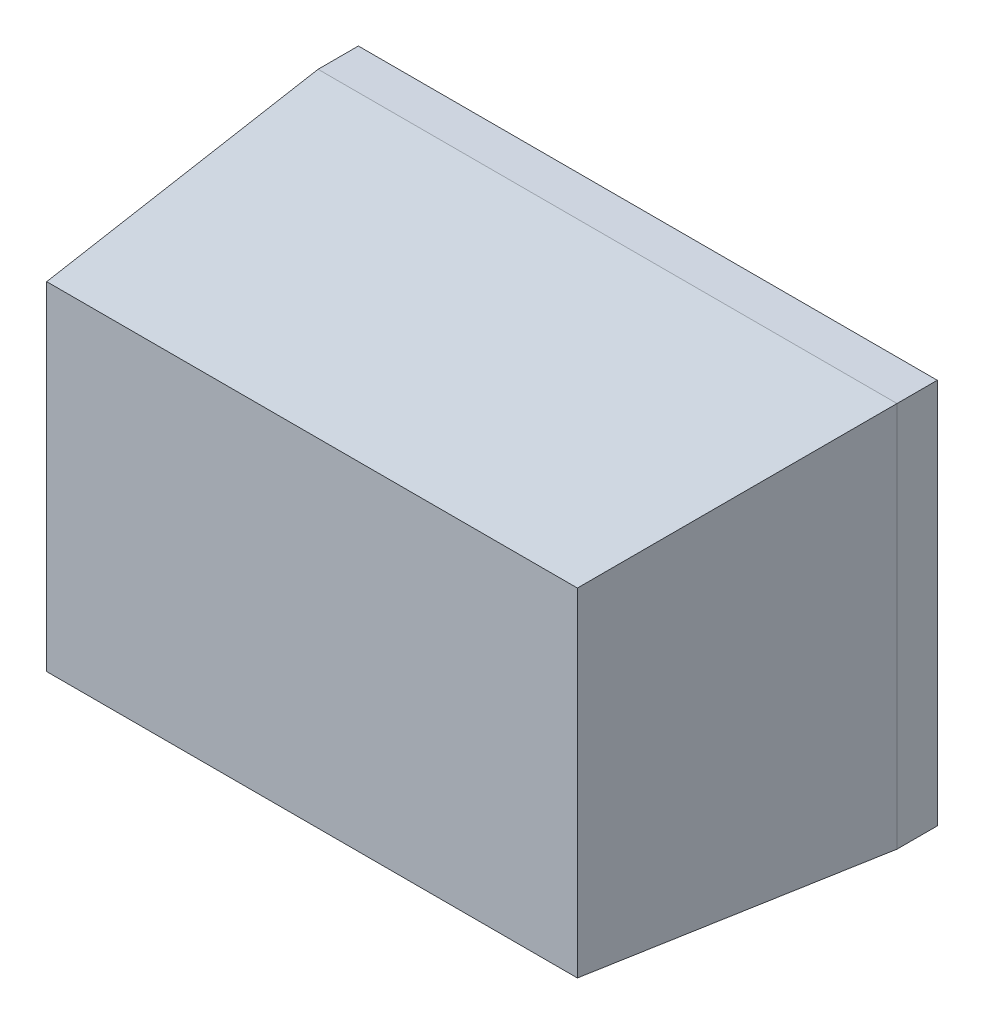
ISO-10303-21;
HEADER;
FILE_DESCRIPTION(('STEP AP214'),'2;1');
FILE_NAME('part.step','',(''),(''),'','','');
FILE_SCHEMA(('AUTOMOTIVE_DESIGN { 1 0 10303 214 1 1 1 1 }'));
ENDSEC;
DATA;
#1=APPLICATION_CONTEXT('core data for automotive mechanical design processes');
#2=APPLICATION_PROTOCOL_DEFINITION('international standard','automotive_design',2000,#1);
#3=PRODUCT_CONTEXT('',#1,'mechanical');
#4=PRODUCT('Part','Part','',(#3));
#5=PRODUCT_RELATED_PRODUCT_CATEGORY('part','',(#4));
#6=PRODUCT_DEFINITION_FORMATION('','',#4);
#7=PRODUCT_DEFINITION_CONTEXT('part definition',#1,'design');
#8=PRODUCT_DEFINITION('design','',#6,#7);
#9=PRODUCT_DEFINITION_SHAPE('','',#8);
#10=(LENGTH_UNIT() NAMED_UNIT(*) SI_UNIT(.MILLI.,.METRE.));
#11=(NAMED_UNIT(*) PLANE_ANGLE_UNIT() SI_UNIT($,.RADIAN.));
#12=(NAMED_UNIT(*) SI_UNIT($,.STERADIAN.) SOLID_ANGLE_UNIT());
#13=UNCERTAINTY_MEASURE_WITH_UNIT(LENGTH_MEASURE(1.E-05),#10,'distance_accuracy_value','');
#14=(GEOMETRIC_REPRESENTATION_CONTEXT(3) GLOBAL_UNCERTAINTY_ASSIGNED_CONTEXT((#13)) GLOBAL_UNIT_ASSIGNED_CONTEXT((#10,
#11,#12)) REPRESENTATION_CONTEXT('',''));
#15=CARTESIAN_POINT('',(0.,0.,0.));
#16=DIRECTION('',(0.,0.,1.));
#17=DIRECTION('',(1.,0.,0.));
#18=AXIS2_PLACEMENT_3D('',#15,#16,#17);
#19=CARTESIAN_POINT('',(-0.6,-0.4,0.698));
#20=DIRECTION('',(0.,0.,1.));
#21=DIRECTION('',(1.,0.,0.));
#22=AXIS2_PLACEMENT_3D('',#19,#20,#21);
#23=PLANE('',#22);
#24=DIRECTION('',(0.,1.,0.));
#25=VECTOR('',#24,1.);
#26=CARTESIAN_POINT('',(0.550000000000018,-0.4,0.698000000000001));
#27=LINE('',#26,#25);
#28=CARTESIAN_POINT('',(0.550000000000004,0.350000000000004,0.698000000000001));
#29=VERTEX_POINT('',#28);
#30=CARTESIAN_POINT('',(0.550000000000005,-0.350000000000009,0.698000000000001));
#31=VERTEX_POINT('',#30);
#32=EDGE_CURVE('E87',#29,#31,#27,.F.);
#33=ORIENTED_EDGE('',*,*,#32,.F.);
#34=DIRECTION('',(1.,0.,0.));
#35=VECTOR('',#34,1.);
#36=CARTESIAN_POINT('',(-0.6,0.350000000000018,0.698000000000002));
#37=LINE('',#36,#35);
#38=CARTESIAN_POINT('',(-0.550000000000004,0.350000000000004,0.698000000000001));
#39=VERTEX_POINT('',#38);
#40=EDGE_CURVE('E79',#39,#29,#37,.T.);
#41=ORIENTED_EDGE('',*,*,#40,.F.);
#42=DIRECTION('',(0.,1.,0.));
#43=VECTOR('',#42,1.);
#44=CARTESIAN_POINT('',(-0.550000000000018,-0.4,0.698000000000001));
#45=LINE('',#44,#43);
#46=CARTESIAN_POINT('',(-0.550000000000004,-0.350000000000004,0.698000000000001));
#47=VERTEX_POINT('',#46);
#48=EDGE_CURVE('E20',#39,#47,#45,.F.);
#49=ORIENTED_EDGE('',*,*,#48,.T.);
#50=DIRECTION('',(1.,0.,0.));
#51=VECTOR('',#50,1.);
#52=CARTESIAN_POINT('',(-0.6,-0.350000000000018,0.698000000000002));
#53=LINE('',#52,#51);
#54=EDGE_CURVE('E68',#47,#31,#53,.T.);
#55=ORIENTED_EDGE('',*,*,#54,.T.);
#56=EDGE_LOOP('',(#33,#41,#49,#55));
#57=FACE_BOUND('',#56,.T.);
#58=ADVANCED_FACE('F17',(#57),#23,.T.);
#59=CARTESIAN_POINT('',(-0.575,-0.4,0.39175));
#60=DIRECTION('',(0.996684615822613,0.,-0.0813620094548484));
#61=DIRECTION('',(-0.0813620094548484,0.,-0.996684615822613));
#62=AXIS2_PLACEMENT_3D('',#59,#60,#61);
#63=PLANE('',#62);
#64=DIRECTION('',(0.0810940399844702,-0.0810940399844122,0.993401989809766));
#65=VECTOR('',#64,1.);
#66=CARTESIAN_POINT('',(-0.6,0.399999999999982,0.0854999999999985));
#67=LINE('',#66,#65);
#68=CARTESIAN_POINT('',(-0.599999999999991,0.399999999999998,0.0854999999999991));
#69=VERTEX_POINT('',#68);
#70=EDGE_CURVE('E94',#69,#39,#67,.T.);
#71=ORIENTED_EDGE('',*,*,#70,.F.);
#72=DIRECTION('',(0.,1.,0.));
#73=VECTOR('',#72,1.);
#74=CARTESIAN_POINT('',(-0.6,-0.4,0.0855));
#75=LINE('',#74,#73);
#76=CARTESIAN_POINT('',(-0.599999999999991,-0.399999999999998,0.0854999999999991));
#77=VERTEX_POINT('',#76);
#78=EDGE_CURVE('E84',#69,#77,#75,.F.);
#79=ORIENTED_EDGE('',*,*,#78,.T.);
#80=DIRECTION('',(0.0810940399844702,0.0810940399844122,0.993401989809766));
#81=VECTOR('',#80,1.);
#82=CARTESIAN_POINT('',(-0.6,-0.399999999999982,0.0854999999999985));
#83=LINE('',#82,#81);
#84=EDGE_CURVE('E75',#77,#47,#83,.T.);
#85=ORIENTED_EDGE('',*,*,#84,.T.);
#86=ORIENTED_EDGE('',*,*,#48,.F.);
#87=EDGE_LOOP('',(#71,#79,#85,#86));
#88=FACE_BOUND('',#87,.T.);
#89=ADVANCED_FACE('F83',(#88),#63,.F.);
#90=CARTESIAN_POINT('',(-0.6,-0.375,0.39175));
#91=DIRECTION('',(0.,0.996684615822613,-0.0813620094548484));
#92=DIRECTION('',(0.,0.0813620094548484,0.996684615822613));
#93=AXIS2_PLACEMENT_3D('',#90,#91,#92);
#94=PLANE('',#93);
#95=DIRECTION('',(1.,0.,0.));
#96=VECTOR('',#95,1.);
#97=CARTESIAN_POINT('',(-0.6,-0.4,0.0855));
#98=LINE('',#97,#96);
#99=CARTESIAN_POINT('',(0.599999999999998,-0.399999999999991,0.0854999999999991));
#100=VERTEX_POINT('',#99);
#101=EDGE_CURVE('E100',#77,#100,#98,.T.);
#102=ORIENTED_EDGE('',*,*,#101,.T.);
#103=DIRECTION('',(0.0810940399844122,-0.0810940399844704,-0.993401989809767));
#104=VECTOR('',#103,1.);
#105=CARTESIAN_POINT('',(0.550000000000018,-0.35,0.698000000000001));
#106=LINE('',#105,#104);
#107=EDGE_CURVE('E77',#31,#100,#106,.T.);
#108=ORIENTED_EDGE('',*,*,#107,.F.);
#109=ORIENTED_EDGE('',*,*,#54,.F.);
#110=ORIENTED_EDGE('',*,*,#84,.F.);
#111=EDGE_LOOP('',(#102,#108,#109,#110));
#112=FACE_BOUND('',#111,.T.);
#113=ADVANCED_FACE('F73',(#112),#94,.F.);
#114=CARTESIAN_POINT('',(0.575,-0.4,0.39175));
#115=DIRECTION('',(0.996684615822613,0.,0.0813620094548484));
#116=DIRECTION('',(0.0813620094548484,0.,-0.996684615822613));
#117=AXIS2_PLACEMENT_3D('',#114,#115,#116);
#118=PLANE('',#117);
#119=DIRECTION('',(0.0810940399844702,0.0810940399844122,-0.993401989809766));
#120=VECTOR('',#119,1.);
#121=CARTESIAN_POINT('',(0.55,0.350000000000018,0.698000000000002));
#122=LINE('',#121,#120);
#123=CARTESIAN_POINT('',(0.599999999999991,0.399999999999998,0.0854999999999991));
#124=VERTEX_POINT('',#123);
#125=EDGE_CURVE('E92',#29,#124,#122,.T.);
#126=ORIENTED_EDGE('',*,*,#125,.F.);
#127=ORIENTED_EDGE('',*,*,#32,.T.);
#128=ORIENTED_EDGE('',*,*,#107,.T.);
#129=DIRECTION('',(0.,1.,0.));
#130=VECTOR('',#129,1.);
#131=CARTESIAN_POINT('',(0.6,-0.4,0.0855));
#132=LINE('',#131,#130);
#133=EDGE_CURVE('E104',#124,#100,#132,.F.);
#134=ORIENTED_EDGE('',*,*,#133,.F.);
#135=EDGE_LOOP('',(#126,#127,#128,#134));
#136=FACE_BOUND('',#135,.T.);
#137=ADVANCED_FACE('F150',(#136),#118,.T.);
#138=CARTESIAN_POINT('',(-0.6,0.375,0.39175));
#139=DIRECTION('',(0.,0.996684615822613,0.0813620094548484));
#140=DIRECTION('',(0.,-0.0813620094548484,0.996684615822613));
#141=AXIS2_PLACEMENT_3D('',#138,#139,#140);
#142=PLANE('',#141);
#143=DIRECTION('',(1.,0.,0.));
#144=VECTOR('',#143,1.);
#145=CARTESIAN_POINT('',(-0.6,0.4,0.0855));
#146=LINE('',#145,#144);
#147=EDGE_CURVE('E111',#69,#124,#146,.T.);
#148=ORIENTED_EDGE('',*,*,#147,.F.);
#149=ORIENTED_EDGE('',*,*,#70,.T.);
#150=ORIENTED_EDGE('',*,*,#40,.T.);
#151=ORIENTED_EDGE('',*,*,#125,.T.);
#152=EDGE_LOOP('',(#148,#149,#150,#151));
#153=FACE_BOUND('',#152,.T.);
#154=ADVANCED_FACE('F147',(#153),#142,.T.);
#155=CARTESIAN_POINT('',(-0.6,-0.4,0.002));
#156=DIRECTION('',(1.,0.,0.));
#157=DIRECTION('',(0.,0.,-1.));
#158=AXIS2_PLACEMENT_3D('',#155,#156,#157);
#159=PLANE('',#158);
#160=DIRECTION('',(0.,0.,1.));
#161=VECTOR('',#160,1.);
#162=CARTESIAN_POINT('',(-0.6,0.4,0.002));
#163=LINE('',#162,#161);
#164=CARTESIAN_POINT('',(-0.6,0.4,0.002));
#165=VERTEX_POINT('',#164);
#166=EDGE_CURVE('E108',#165,#69,#163,.T.);
#167=ORIENTED_EDGE('',*,*,#166,.F.);
#168=DIRECTION('',(0.,1.,0.));
#169=VECTOR('',#168,1.);
#170=CARTESIAN_POINT('',(-0.6,-0.4,0.002));
#171=LINE('',#170,#169);
#172=CARTESIAN_POINT('',(-0.6,-0.4,0.002));
#173=VERTEX_POINT('',#172);
#174=EDGE_CURVE('E113',#165,#173,#171,.F.);
#175=ORIENTED_EDGE('',*,*,#174,.T.);
#176=DIRECTION('',(0.,0.,1.));
#177=VECTOR('',#176,1.);
#178=CARTESIAN_POINT('',(-0.6,-0.4,0.002));
#179=LINE('',#178,#177);
#180=EDGE_CURVE('E97',#173,#77,#179,.T.);
#181=ORIENTED_EDGE('',*,*,#180,.T.);
#182=ORIENTED_EDGE('',*,*,#78,.F.);
#183=EDGE_LOOP('',(#167,#175,#181,#182));
#184=FACE_BOUND('',#183,.T.);
#185=ADVANCED_FACE('F131',(#184),#159,.F.);
#186=CARTESIAN_POINT('',(-0.6,-0.4,0.002));
#187=DIRECTION('',(0.,1.,0.));
#188=DIRECTION('',(0.,0.,1.));
#189=AXIS2_PLACEMENT_3D('',#186,#187,#188);
#190=PLANE('',#189);
#191=ORIENTED_EDGE('',*,*,#180,.F.);
#192=DIRECTION('',(1.,0.,0.));
#193=VECTOR('',#192,1.);
#194=CARTESIAN_POINT('',(-0.6,-0.4,0.002));
#195=LINE('',#194,#193);
#196=CARTESIAN_POINT('',(0.6,-0.4,0.002));
#197=VERTEX_POINT('',#196);
#198=EDGE_CURVE('E116',#173,#197,#195,.T.);
#199=ORIENTED_EDGE('',*,*,#198,.T.);
#200=DIRECTION('',(0.,0.,-1.));
#201=VECTOR('',#200,1.);
#202=CARTESIAN_POINT('',(0.6,-0.4,0.002));
#203=LINE('',#202,#201);
#204=EDGE_CURVE('E102',#100,#197,#203,.T.);
#205=ORIENTED_EDGE('',*,*,#204,.F.);
#206=ORIENTED_EDGE('',*,*,#101,.F.);
#207=EDGE_LOOP('',(#191,#199,#205,#206));
#208=FACE_BOUND('',#207,.T.);
#209=ADVANCED_FACE('F128',(#208),#190,.F.);
#210=CARTESIAN_POINT('',(0.6,-0.4,0.002));
#211=DIRECTION('',(1.,0.,0.));
#212=DIRECTION('',(0.,0.,-1.));
#213=AXIS2_PLACEMENT_3D('',#210,#211,#212);
#214=PLANE('',#213);
#215=DIRECTION('',(0.,0.,1.));
#216=VECTOR('',#215,1.);
#217=CARTESIAN_POINT('',(0.6,0.4,0.002));
#218=LINE('',#217,#216);
#219=CARTESIAN_POINT('',(0.6,0.4,0.002));
#220=VERTEX_POINT('',#219);
#221=EDGE_CURVE('E34',#124,#220,#218,.F.);
#222=ORIENTED_EDGE('',*,*,#221,.F.);
#223=ORIENTED_EDGE('',*,*,#133,.T.);
#224=ORIENTED_EDGE('',*,*,#204,.T.);
#225=DIRECTION('',(0.,1.,0.));
#226=VECTOR('',#225,1.);
#227=CARTESIAN_POINT('',(0.6,-0.4,0.002));
#228=LINE('',#227,#226);
#229=EDGE_CURVE('E26',#197,#220,#228,.T.);
#230=ORIENTED_EDGE('',*,*,#229,.T.);
#231=EDGE_LOOP('',(#222,#223,#224,#230));
#232=FACE_BOUND('',#231,.T.);
#233=ADVANCED_FACE('F122',(#232),#214,.T.);
#234=CARTESIAN_POINT('',(-0.6,0.4,0.002));
#235=DIRECTION('',(0.,1.,0.));
#236=DIRECTION('',(0.,0.,1.));
#237=AXIS2_PLACEMENT_3D('',#234,#235,#236);
#238=PLANE('',#237);
#239=ORIENTED_EDGE('',*,*,#166,.T.);
#240=ORIENTED_EDGE('',*,*,#147,.T.);
#241=ORIENTED_EDGE('',*,*,#221,.T.);
#242=DIRECTION('',(1.,0.,0.));
#243=VECTOR('',#242,1.);
#244=CARTESIAN_POINT('',(-0.6,0.4,0.002));
#245=LINE('',#244,#243);
#246=EDGE_CURVE('E11',#220,#165,#245,.F.);
#247=ORIENTED_EDGE('',*,*,#246,.T.);
#248=EDGE_LOOP('',(#239,#240,#241,#247));
#249=FACE_BOUND('',#248,.T.);
#250=ADVANCED_FACE('F132',(#249),#238,.T.);
#251=CARTESIAN_POINT('',(-0.6,-0.4,0.002));
#252=DIRECTION('',(0.,0.,1.));
#253=DIRECTION('',(1.,0.,0.));
#254=AXIS2_PLACEMENT_3D('',#251,#252,#253);
#255=PLANE('',#254);
#256=ORIENTED_EDGE('',*,*,#229,.F.);
#257=ORIENTED_EDGE('',*,*,#198,.F.);
#258=ORIENTED_EDGE('',*,*,#174,.F.);
#259=ORIENTED_EDGE('',*,*,#246,.F.);
#260=EDGE_LOOP('',(#256,#257,#258,#259));
#261=FACE_BOUND('',#260,.T.);
#262=ADVANCED_FACE('F126',(#261),#255,.F.);
#263=CLOSED_SHELL('',(#58,#89,#113,#137,#154,#185,#209,#233,#250,#262));
#264=MANIFOLD_SOLID_BREP('B1',#263);
#265=ADVANCED_BREP_SHAPE_REPRESENTATION('',(#18,#264),#14);
#266=SHAPE_DEFINITION_REPRESENTATION(#9,#265);
ENDSEC;
END-ISO-10303-21;
